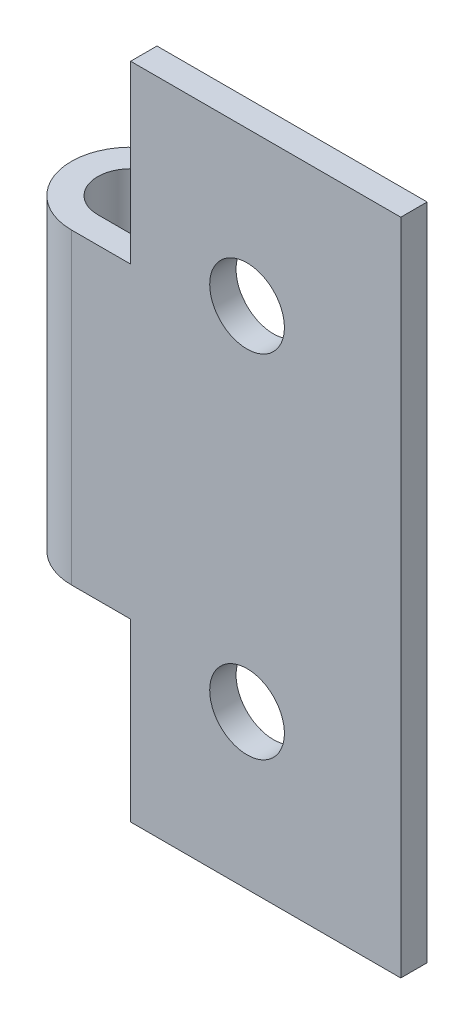
ISO-10303-21;
HEADER;
FILE_DESCRIPTION(('STEP AP214'),'2;1');
FILE_NAME('part.step','',(''),(''),'','','');
FILE_SCHEMA(('AUTOMOTIVE_DESIGN { 1 0 10303 214 1 1 1 1 }'));
ENDSEC;
DATA;
#1=APPLICATION_CONTEXT('core data for automotive mechanical design processes');
#2=APPLICATION_PROTOCOL_DEFINITION('international standard','automotive_design',2000,#1);
#3=PRODUCT_CONTEXT('',#1,'mechanical');
#4=PRODUCT('Part','Part','',(#3));
#5=PRODUCT_RELATED_PRODUCT_CATEGORY('part','',(#4));
#6=PRODUCT_DEFINITION_FORMATION('','',#4);
#7=PRODUCT_DEFINITION_CONTEXT('part definition',#1,'design');
#8=PRODUCT_DEFINITION('design','',#6,#7);
#9=PRODUCT_DEFINITION_SHAPE('','',#8);
#10=(LENGTH_UNIT() NAMED_UNIT(*) SI_UNIT(.MILLI.,.METRE.));
#11=(NAMED_UNIT(*) PLANE_ANGLE_UNIT() SI_UNIT($,.RADIAN.));
#12=(NAMED_UNIT(*) SI_UNIT($,.STERADIAN.) SOLID_ANGLE_UNIT());
#13=UNCERTAINTY_MEASURE_WITH_UNIT(LENGTH_MEASURE(1.E-05),#10,'distance_accuracy_value','');
#14=(GEOMETRIC_REPRESENTATION_CONTEXT(3) GLOBAL_UNCERTAINTY_ASSIGNED_CONTEXT((#13)) GLOBAL_UNIT_ASSIGNED_CONTEXT((#10,
#11,#12)) REPRESENTATION_CONTEXT('',''));
#15=CARTESIAN_POINT('',(0.,0.,0.));
#16=DIRECTION('',(0.,0.,1.));
#17=DIRECTION('',(1.,0.,0.));
#18=AXIS2_PLACEMENT_3D('',#15,#16,#17);
#19=CARTESIAN_POINT('',(0.,-30.,-2.1));
#20=DIRECTION('',(0.,1.,0.));
#21=DIRECTION('',(0.,0.,1.));
#22=AXIS2_PLACEMENT_3D('',#19,#20,#21);
#23=CYLINDRICAL_SURFACE('',#22,2.7);
#24=DIRECTION('',(0.,1.,0.));
#25=VECTOR('',#24,1.);
#26=CARTESIAN_POINT('',(0.,-30.,0.599999999999999));
#27=LINE('',#26,#25);
#28=CARTESIAN_POINT('',(0.,-22.,0.599999999999999));
#29=VERTEX_POINT('',#28);
#30=CARTESIAN_POINT('',(0.,-8.,0.599999999999999));
#31=VERTEX_POINT('',#30);
#32=EDGE_CURVE('E48',#29,#31,#27,.T.);
#33=ORIENTED_EDGE('',*,*,#32,.T.);
#34=CARTESIAN_POINT('',(0.,-8.,-2.1));
#35=DIRECTION('',(0.,-1.,0.));
#36=DIRECTION('',(0.,0.,-1.));
#37=AXIS2_PLACEMENT_3D('',#34,#35,#36);
#38=CIRCLE('',#37,2.7);
#39=CARTESIAN_POINT('',(2.30184189566561,-8.,-0.688786377844038));
#40=VERTEX_POINT('',#39);
#41=EDGE_CURVE('E139',#31,#40,#38,.T.);
#42=ORIENTED_EDGE('',*,*,#41,.T.);
#43=DIRECTION('',(0.,1.,0.));
#44=VECTOR('',#43,1.);
#45=CARTESIAN_POINT('',(2.30184189566561,-30.,-0.688786377844038));
#46=LINE('',#45,#44);
#47=CARTESIAN_POINT('',(2.30184189566561,-22.,-0.688786377844038));
#48=VERTEX_POINT('',#47);
#49=EDGE_CURVE('E138',#48,#40,#46,.T.);
#50=ORIENTED_EDGE('',*,*,#49,.F.);
#51=CARTESIAN_POINT('',(0.,-22.,-2.1));
#52=DIRECTION('',(0.,-1.,0.));
#53=DIRECTION('',(0.,0.,-1.));
#54=AXIS2_PLACEMENT_3D('',#51,#52,#53);
#55=CIRCLE('',#54,2.7);
#56=EDGE_CURVE('E175',#29,#48,#55,.T.);
#57=ORIENTED_EDGE('',*,*,#56,.F.);
#58=EDGE_LOOP('',(#33,#42,#50,#57));
#59=FACE_BOUND('',#58,.T.);
#60=ADVANCED_FACE('F39',(#59),#23,.T.);
#61=CARTESIAN_POINT('',(2.30184189566561,-30.,-0.688786377844038));
#62=DIRECTION('',(-0.522671711909616,0.,0.852534035431707));
#63=DIRECTION('',(0.852534035431707,0.,0.522671711909616));
#64=AXIS2_PLACEMENT_3D('',#61,#62,#63);
#65=PLANE('',#64);
#66=ORIENTED_EDGE('',*,*,#49,.T.);
#67=DIRECTION('',(-0.852534035431707,0.,-0.522671711909616));
#68=VECTOR('',#67,1.);
#69=CARTESIAN_POINT('',(1.27880105314756,-8.,-1.31599243213558));
#70=LINE('',#69,#68);
#71=CARTESIAN_POINT('',(1.27880105314756,-8.,-1.31599243213558));
#72=VERTEX_POINT('',#71);
#73=EDGE_CURVE('E120',#40,#72,#70,.T.);
#74=ORIENTED_EDGE('',*,*,#73,.T.);
#75=DIRECTION('',(0.,1.,0.));
#76=VECTOR('',#75,1.);
#77=CARTESIAN_POINT('',(1.27880105314756,-30.,-1.31599243213558));
#78=LINE('',#77,#76);
#79=CARTESIAN_POINT('',(1.27880105314756,-22.,-1.31599243213558));
#80=VERTEX_POINT('',#79);
#81=EDGE_CURVE('E136',#80,#72,#78,.T.);
#82=ORIENTED_EDGE('',*,*,#81,.F.);
#83=DIRECTION('',(-0.852534035431707,0.,-0.522671711909616));
#84=VECTOR('',#83,1.);
#85=CARTESIAN_POINT('',(1.27880105314756,-22.,-1.31599243213558));
#86=LINE('',#85,#84);
#87=EDGE_CURVE('E168',#48,#80,#86,.T.);
#88=ORIENTED_EDGE('',*,*,#87,.F.);
#89=EDGE_LOOP('',(#66,#74,#82,#88));
#90=FACE_BOUND('',#89,.T.);
#91=ADVANCED_FACE('F134',(#90),#65,.T.);
#92=CARTESIAN_POINT('',(0.,-30.,-2.1));
#93=DIRECTION('',(0.,1.,0.));
#94=DIRECTION('',(0.,0.,1.));
#95=AXIS2_PLACEMENT_3D('',#92,#93,#94);
#96=CYLINDRICAL_SURFACE('',#95,1.5);
#97=ORIENTED_EDGE('',*,*,#81,.T.);
#98=CARTESIAN_POINT('',(0.,-8.,-2.1));
#99=DIRECTION('',(0.,1.,0.));
#100=DIRECTION('',(0.,0.,-1.));
#101=AXIS2_PLACEMENT_3D('',#98,#99,#100);
#102=CIRCLE('',#101,1.5);
#103=CARTESIAN_POINT('',(0.,-8.,-0.600000000000001));
#104=VERTEX_POINT('',#103);
#105=EDGE_CURVE('E117',#72,#104,#102,.T.);
#106=ORIENTED_EDGE('',*,*,#105,.T.);
#107=DIRECTION('',(0.,1.,0.));
#108=VECTOR('',#107,1.);
#109=CARTESIAN_POINT('',(0.,-30.,-0.600000000000001));
#110=LINE('',#109,#108);
#111=CARTESIAN_POINT('',(0.,-22.,-0.600000000000001));
#112=VERTEX_POINT('',#111);
#113=EDGE_CURVE('E144',#112,#104,#110,.T.);
#114=ORIENTED_EDGE('',*,*,#113,.F.);
#115=CARTESIAN_POINT('',(0.,-22.,-2.1));
#116=DIRECTION('',(0.,1.,0.));
#117=DIRECTION('',(0.,0.,-1.));
#118=AXIS2_PLACEMENT_3D('',#115,#116,#117);
#119=CIRCLE('',#118,1.5);
#120=EDGE_CURVE('E143',#80,#112,#119,.T.);
#121=ORIENTED_EDGE('',*,*,#120,.F.);
#122=EDGE_LOOP('',(#97,#106,#114,#121));
#123=FACE_BOUND('',#122,.T.);
#124=ADVANCED_FACE('F142',(#123),#96,.F.);
#125=CARTESIAN_POINT('',(0.,-30.,0.599999999999999));
#126=DIRECTION('',(0.,0.,1.));
#127=DIRECTION('',(1.,0.,0.));
#128=AXIS2_PLACEMENT_3D('',#125,#126,#127);
#129=PLANE('',#128);
#130=CARTESIAN_POINT('',(8.,-23.,0.599999999999999));
#131=DIRECTION('',(0.,0.,-1.));
#132=DIRECTION('',(-1.,0.,0.));
#133=AXIS2_PLACEMENT_3D('',#130,#131,#132);
#134=CIRCLE('',#133,1.7);
#135=CARTESIAN_POINT('',(6.3,-23.,0.599999999999999));
#136=VERTEX_POINT('',#135);
#137=EDGE_CURVE('E173',#136,#136,#134,.T.);
#138=ORIENTED_EDGE('',*,*,#137,.T.);
#139=EDGE_LOOP('',(#138));
#140=FACE_BOUND('',#139,.T.);
#141=CARTESIAN_POINT('',(8.,-7.,0.599999999999999));
#142=DIRECTION('',(0.,0.,-1.));
#143=DIRECTION('',(-1.,0.,0.));
#144=AXIS2_PLACEMENT_3D('',#141,#142,#143);
#145=CIRCLE('',#144,1.7);
#146=CARTESIAN_POINT('',(6.3,-7.,0.599999999999999));
#147=VERTEX_POINT('',#146);
#148=EDGE_CURVE('E186',#147,#147,#145,.T.);
#149=ORIENTED_EDGE('',*,*,#148,.T.);
#150=EDGE_LOOP('',(#149));
#151=FACE_BOUND('',#150,.T.);
#152=DIRECTION('',(1.,0.,0.));
#153=VECTOR('',#152,1.);
#154=CARTESIAN_POINT('',(0.,0.,0.599999999999999));
#155=LINE('',#154,#153);
#156=CARTESIAN_POINT('',(2.7,0.,0.599999999999999));
#157=VERTEX_POINT('',#156);
#158=CARTESIAN_POINT('',(15.,0.,0.599999999999998));
#159=VERTEX_POINT('',#158);
#160=EDGE_CURVE('E150',#157,#159,#155,.T.);
#161=ORIENTED_EDGE('',*,*,#160,.F.);
#162=DIRECTION('',(0.,1.,0.));
#163=VECTOR('',#162,1.);
#164=CARTESIAN_POINT('',(2.7,-8.,0.599999999999999));
#165=LINE('',#164,#163);
#166=CARTESIAN_POINT('',(2.7,-8.,0.599999999999999));
#167=VERTEX_POINT('',#166);
#168=EDGE_CURVE('E56',#167,#157,#165,.T.);
#169=ORIENTED_EDGE('',*,*,#168,.F.);
#170=DIRECTION('',(-1.,0.,0.));
#171=VECTOR('',#170,1.);
#172=CARTESIAN_POINT('',(0.,-8.,0.599999999999999));
#173=LINE('',#172,#171);
#174=EDGE_CURVE('E205',#167,#31,#173,.T.);
#175=ORIENTED_EDGE('',*,*,#174,.T.);
#176=ORIENTED_EDGE('',*,*,#32,.F.);
#177=DIRECTION('',(-1.,0.,0.));
#178=VECTOR('',#177,1.);
#179=CARTESIAN_POINT('',(0.,-22.,0.599999999999999));
#180=LINE('',#179,#178);
#181=CARTESIAN_POINT('',(2.7,-22.,0.599999999999999));
#182=VERTEX_POINT('',#181);
#183=EDGE_CURVE('E177',#182,#29,#180,.T.);
#184=ORIENTED_EDGE('',*,*,#183,.F.);
#185=DIRECTION('',(0.,-1.,0.));
#186=VECTOR('',#185,1.);
#187=CARTESIAN_POINT('',(2.7,-22.,0.599999999999999));
#188=LINE('',#187,#186);
#189=CARTESIAN_POINT('',(2.7,-30.,0.599999999999999));
#190=VERTEX_POINT('',#189);
#191=EDGE_CURVE('E159',#182,#190,#188,.T.);
#192=ORIENTED_EDGE('',*,*,#191,.T.);
#193=DIRECTION('',(1.,0.,0.));
#194=VECTOR('',#193,1.);
#195=CARTESIAN_POINT('',(0.,-30.,0.599999999999999));
#196=LINE('',#195,#194);
#197=CARTESIAN_POINT('',(15.,-30.,0.599999999999998));
#198=VERTEX_POINT('',#197);
#199=EDGE_CURVE('E160',#190,#198,#196,.T.);
#200=ORIENTED_EDGE('',*,*,#199,.T.);
#201=DIRECTION('',(0.,1.,0.));
#202=VECTOR('',#201,1.);
#203=CARTESIAN_POINT('',(15.,-30.,0.599999999999998));
#204=LINE('',#203,#202);
#205=EDGE_CURVE('E11',#198,#159,#204,.T.);
#206=ORIENTED_EDGE('',*,*,#205,.T.);
#207=EDGE_LOOP('',(#161,#169,#175,#176,#184,#192,#200,#206));
#208=FACE_BOUND('',#207,.T.);
#209=ADVANCED_FACE('F214',(#140,#151,#208),#129,.T.);
#210=CARTESIAN_POINT('',(0.,-30.,-0.600000000000001));
#211=DIRECTION('',(0.,0.,-1.));
#212=DIRECTION('',(-1.,0.,0.));
#213=AXIS2_PLACEMENT_3D('',#210,#211,#212);
#214=PLANE('',#213);
#215=CARTESIAN_POINT('',(8.,-23.,-0.600000000000001));
#216=DIRECTION('',(0.,0.,-1.));
#217=DIRECTION('',(-1.,0.,0.));
#218=AXIS2_PLACEMENT_3D('',#215,#216,#217);
#219=CIRCLE('',#218,1.7);
#220=CARTESIAN_POINT('',(6.3,-23.,-0.600000000000001));
#221=VERTEX_POINT('',#220);
#222=EDGE_CURVE('E193',#221,#221,#219,.T.);
#223=ORIENTED_EDGE('',*,*,#222,.F.);
#224=EDGE_LOOP('',(#223));
#225=FACE_BOUND('',#224,.T.);
#226=CARTESIAN_POINT('',(8.,-7.,-0.600000000000001));
#227=DIRECTION('',(0.,0.,-1.));
#228=DIRECTION('',(-1.,0.,0.));
#229=AXIS2_PLACEMENT_3D('',#226,#227,#228);
#230=CIRCLE('',#229,1.7);
#231=CARTESIAN_POINT('',(6.3,-7.,-0.600000000000001));
#232=VERTEX_POINT('',#231);
#233=EDGE_CURVE('E189',#232,#232,#230,.T.);
#234=ORIENTED_EDGE('',*,*,#233,.F.);
#235=EDGE_LOOP('',(#234));
#236=FACE_BOUND('',#235,.T.);
#237=DIRECTION('',(1.,0.,0.));
#238=VECTOR('',#237,1.);
#239=CARTESIAN_POINT('',(0.,-8.,-0.600000000000001));
#240=LINE('',#239,#238);
#241=CARTESIAN_POINT('',(2.7,-8.,-0.600000000000001));
#242=VERTEX_POINT('',#241);
#243=EDGE_CURVE('E124',#104,#242,#240,.T.);
#244=ORIENTED_EDGE('',*,*,#243,.T.);
#245=DIRECTION('',(0.,1.,0.));
#246=VECTOR('',#245,1.);
#247=CARTESIAN_POINT('',(2.7,-8.,-0.600000000000001));
#248=LINE('',#247,#246);
#249=CARTESIAN_POINT('',(2.7,0.,-0.600000000000001));
#250=VERTEX_POINT('',#249);
#251=EDGE_CURVE('E190',#242,#250,#248,.T.);
#252=ORIENTED_EDGE('',*,*,#251,.T.);
#253=DIRECTION('',(-1.,0.,0.));
#254=VECTOR('',#253,1.);
#255=CARTESIAN_POINT('',(0.,0.,-0.600000000000001));
#256=LINE('',#255,#254);
#257=CARTESIAN_POINT('',(15.,0.,-0.600000000000002));
#258=VERTEX_POINT('',#257);
#259=EDGE_CURVE('E153',#258,#250,#256,.T.);
#260=ORIENTED_EDGE('',*,*,#259,.F.);
#261=DIRECTION('',(0.,1.,0.));
#262=VECTOR('',#261,1.);
#263=CARTESIAN_POINT('',(15.,-30.,-0.600000000000002));
#264=LINE('',#263,#262);
#265=CARTESIAN_POINT('',(15.,-30.,-0.600000000000002));
#266=VERTEX_POINT('',#265);
#267=EDGE_CURVE('E43',#266,#258,#264,.T.);
#268=ORIENTED_EDGE('',*,*,#267,.F.);
#269=DIRECTION('',(-1.,0.,0.));
#270=VECTOR('',#269,1.);
#271=CARTESIAN_POINT('',(0.,-30.,-0.600000000000001));
#272=LINE('',#271,#270);
#273=CARTESIAN_POINT('',(2.7,-30.,-0.600000000000001));
#274=VERTEX_POINT('',#273);
#275=EDGE_CURVE('E162',#266,#274,#272,.T.);
#276=ORIENTED_EDGE('',*,*,#275,.T.);
#277=DIRECTION('',(0.,-1.,0.));
#278=VECTOR('',#277,1.);
#279=CARTESIAN_POINT('',(2.7,-22.,-0.600000000000001));
#280=LINE('',#279,#278);
#281=CARTESIAN_POINT('',(2.7,-22.,-0.600000000000001));
#282=VERTEX_POINT('',#281);
#283=EDGE_CURVE('E64',#282,#274,#280,.T.);
#284=ORIENTED_EDGE('',*,*,#283,.F.);
#285=DIRECTION('',(1.,0.,0.));
#286=VECTOR('',#285,1.);
#287=CARTESIAN_POINT('',(0.,-22.,-0.600000000000001));
#288=LINE('',#287,#286);
#289=EDGE_CURVE('E182',#112,#282,#288,.T.);
#290=ORIENTED_EDGE('',*,*,#289,.F.);
#291=ORIENTED_EDGE('',*,*,#113,.T.);
#292=EDGE_LOOP('',(#244,#252,#260,#268,#276,#284,#290,#291));
#293=FACE_BOUND('',#292,.T.);
#294=ADVANCED_FACE('F223',(#225,#236,#293),#214,.T.);
#295=CARTESIAN_POINT('',(0.,0.,-2.1));
#296=DIRECTION('',(0.,1.,0.));
#297=DIRECTION('',(0.,0.,1.));
#298=AXIS2_PLACEMENT_3D('',#295,#296,#297);
#299=PLANE('',#298);
#300=ORIENTED_EDGE('',*,*,#259,.T.);
#301=DIRECTION('',(0.,0.,1.));
#302=VECTOR('',#301,1.);
#303=CARTESIAN_POINT('',(2.7,0.,-0.600000000000001));
#304=LINE('',#303,#302);
#305=EDGE_CURVE('E129',#250,#157,#304,.T.);
#306=ORIENTED_EDGE('',*,*,#305,.T.);
#307=ORIENTED_EDGE('',*,*,#160,.T.);
#308=DIRECTION('',(0.,0.,-1.));
#309=VECTOR('',#308,1.);
#310=CARTESIAN_POINT('',(15.,0.,-0.600000000000002));
#311=LINE('',#310,#309);
#312=EDGE_CURVE('E156',#159,#258,#311,.T.);
#313=ORIENTED_EDGE('',*,*,#312,.T.);
#314=EDGE_LOOP('',(#300,#306,#307,#313));
#315=FACE_BOUND('',#314,.T.);
#316=ADVANCED_FACE('F219',(#315),#299,.T.);
#317=CARTESIAN_POINT('',(15.,-30.,-0.600000000000002));
#318=DIRECTION('',(1.,0.,0.));
#319=DIRECTION('',(0.,0.,-1.));
#320=AXIS2_PLACEMENT_3D('',#317,#318,#319);
#321=PLANE('',#320);
#322=ORIENTED_EDGE('',*,*,#312,.F.);
#323=ORIENTED_EDGE('',*,*,#205,.F.);
#324=DIRECTION('',(0.,0.,-1.));
#325=VECTOR('',#324,1.);
#326=CARTESIAN_POINT('',(15.,-30.,-0.600000000000002));
#327=LINE('',#326,#325);
#328=EDGE_CURVE('E152',#198,#266,#327,.T.);
#329=ORIENTED_EDGE('',*,*,#328,.T.);
#330=ORIENTED_EDGE('',*,*,#267,.T.);
#331=EDGE_LOOP('',(#322,#323,#329,#330));
#332=FACE_BOUND('',#331,.T.);
#333=ADVANCED_FACE('F41',(#332),#321,.T.);
#334=CARTESIAN_POINT('',(0.,-30.,-2.1));
#335=DIRECTION('',(0.,1.,0.));
#336=DIRECTION('',(0.,0.,1.));
#337=AXIS2_PLACEMENT_3D('',#334,#335,#336);
#338=PLANE('',#337);
#339=ORIENTED_EDGE('',*,*,#199,.F.);
#340=DIRECTION('',(0.,0.,1.));
#341=VECTOR('',#340,1.);
#342=CARTESIAN_POINT('',(2.7,-30.,-0.600000000000001));
#343=LINE('',#342,#341);
#344=EDGE_CURVE('E171',#274,#190,#343,.T.);
#345=ORIENTED_EDGE('',*,*,#344,.F.);
#346=ORIENTED_EDGE('',*,*,#275,.F.);
#347=ORIENTED_EDGE('',*,*,#328,.F.);
#348=EDGE_LOOP('',(#339,#345,#346,#347));
#349=FACE_BOUND('',#348,.T.);
#350=ADVANCED_FACE('F230',(#349),#338,.F.);
#351=CARTESIAN_POINT('',(2.7,-22.,-0.600000000000001));
#352=DIRECTION('',(1.,0.,0.));
#353=DIRECTION('',(0.,0.,-1.));
#354=AXIS2_PLACEMENT_3D('',#351,#352,#353);
#355=PLANE('',#354);
#356=ORIENTED_EDGE('',*,*,#344,.T.);
#357=ORIENTED_EDGE('',*,*,#191,.F.);
#358=DIRECTION('',(0.,0.,1.));
#359=VECTOR('',#358,1.);
#360=CARTESIAN_POINT('',(2.7,-22.,-0.600000000000001));
#361=LINE('',#360,#359);
#362=EDGE_CURVE('E179',#282,#182,#361,.T.);
#363=ORIENTED_EDGE('',*,*,#362,.F.);
#364=ORIENTED_EDGE('',*,*,#283,.T.);
#365=EDGE_LOOP('',(#356,#357,#363,#364));
#366=FACE_BOUND('',#365,.T.);
#367=ADVANCED_FACE('F237',(#366),#355,.F.);
#368=CARTESIAN_POINT('',(0.,-22.,-2.1));
#369=DIRECTION('',(0.,-1.,0.));
#370=DIRECTION('',(0.,0.,-1.));
#371=AXIS2_PLACEMENT_3D('',#368,#369,#370);
#372=PLANE('',#371);
#373=ORIENTED_EDGE('',*,*,#120,.T.);
#374=ORIENTED_EDGE('',*,*,#289,.T.);
#375=ORIENTED_EDGE('',*,*,#362,.T.);
#376=ORIENTED_EDGE('',*,*,#183,.T.);
#377=ORIENTED_EDGE('',*,*,#56,.T.);
#378=ORIENTED_EDGE('',*,*,#87,.T.);
#379=EDGE_LOOP('',(#373,#374,#375,#376,#377,#378));
#380=FACE_BOUND('',#379,.T.);
#381=ADVANCED_FACE('F226',(#380),#372,.T.);
#382=CARTESIAN_POINT('',(8.,-7.,0.599999999999999));
#383=DIRECTION('',(0.,0.,-1.));
#384=DIRECTION('',(-1.,0.,0.));
#385=AXIS2_PLACEMENT_3D('',#382,#383,#384);
#386=CYLINDRICAL_SURFACE('',#385,1.7);
#387=ORIENTED_EDGE('',*,*,#148,.F.);
#388=EDGE_LOOP('',(#387));
#389=FACE_BOUND('',#388,.T.);
#390=ORIENTED_EDGE('',*,*,#233,.T.);
#391=EDGE_LOOP('',(#390));
#392=FACE_BOUND('',#391,.T.);
#393=ADVANCED_FACE('F261',(#389,#392),#386,.F.);
#394=CARTESIAN_POINT('',(8.,-23.,0.599999999999999));
#395=DIRECTION('',(0.,0.,-1.));
#396=DIRECTION('',(-1.,0.,0.));
#397=AXIS2_PLACEMENT_3D('',#394,#395,#396);
#398=CYLINDRICAL_SURFACE('',#397,1.7);
#399=ORIENTED_EDGE('',*,*,#137,.F.);
#400=EDGE_LOOP('',(#399));
#401=FACE_BOUND('',#400,.T.);
#402=ORIENTED_EDGE('',*,*,#222,.T.);
#403=EDGE_LOOP('',(#402));
#404=FACE_BOUND('',#403,.T.);
#405=ADVANCED_FACE('F263',(#401,#404),#398,.F.);
#406=CARTESIAN_POINT('',(2.7,-8.,-0.600000000000001));
#407=DIRECTION('',(-1.,0.,0.));
#408=DIRECTION('',(0.,0.,1.));
#409=AXIS2_PLACEMENT_3D('',#406,#407,#408);
#410=PLANE('',#409);
#411=ORIENTED_EDGE('',*,*,#305,.F.);
#412=ORIENTED_EDGE('',*,*,#251,.F.);
#413=DIRECTION('',(0.,0.,1.));
#414=VECTOR('',#413,1.);
#415=CARTESIAN_POINT('',(2.7,-8.,-0.600000000000001));
#416=LINE('',#415,#414);
#417=EDGE_CURVE('E203',#242,#167,#416,.T.);
#418=ORIENTED_EDGE('',*,*,#417,.T.);
#419=ORIENTED_EDGE('',*,*,#168,.T.);
#420=EDGE_LOOP('',(#411,#412,#418,#419));
#421=FACE_BOUND('',#420,.T.);
#422=ADVANCED_FACE('F221',(#421),#410,.T.);
#423=CARTESIAN_POINT('',(0.,-8.,-2.1));
#424=DIRECTION('',(0.,1.,0.));
#425=DIRECTION('',(0.,0.,-1.));
#426=AXIS2_PLACEMENT_3D('',#423,#424,#425);
#427=PLANE('',#426);
#428=ORIENTED_EDGE('',*,*,#105,.F.);
#429=ORIENTED_EDGE('',*,*,#73,.F.);
#430=ORIENTED_EDGE('',*,*,#41,.F.);
#431=ORIENTED_EDGE('',*,*,#174,.F.);
#432=ORIENTED_EDGE('',*,*,#417,.F.);
#433=ORIENTED_EDGE('',*,*,#243,.F.);
#434=EDGE_LOOP('',(#428,#429,#430,#431,#432,#433));
#435=FACE_BOUND('',#434,.T.);
#436=ADVANCED_FACE('F119',(#435),#427,.T.);
#437=CLOSED_SHELL('',(#60,#91,#124,#209,#294,#316,#333,#350,#367,#381,#393,#405,#422,#436));
#438=MANIFOLD_SOLID_BREP('B2',#437);
#439=ADVANCED_BREP_SHAPE_REPRESENTATION('',(#18,#438),#14);
#440=SHAPE_DEFINITION_REPRESENTATION(#9,#439);
ENDSEC;
END-ISO-10303-21;
